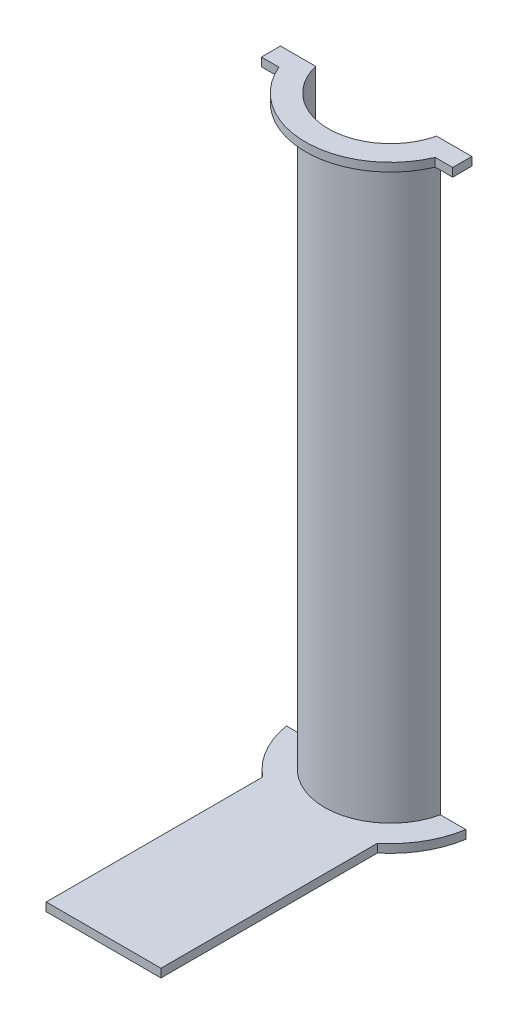
ISO-10303-21;
HEADER;
FILE_DESCRIPTION(('STEP AP214'),'2;1');
FILE_NAME('part.step','',(''),(''),'','','');
FILE_SCHEMA(('AUTOMOTIVE_DESIGN { 1 0 10303 214 1 1 1 1 }'));
ENDSEC;
DATA;
#1=APPLICATION_CONTEXT('core data for automotive mechanical design processes');
#2=APPLICATION_PROTOCOL_DEFINITION('international standard','automotive_design',2000,#1);
#3=PRODUCT_CONTEXT('',#1,'mechanical');
#4=PRODUCT('Part','Part','',(#3));
#5=PRODUCT_RELATED_PRODUCT_CATEGORY('part','',(#4));
#6=PRODUCT_DEFINITION_FORMATION('','',#4);
#7=PRODUCT_DEFINITION_CONTEXT('part definition',#1,'design');
#8=PRODUCT_DEFINITION('design','',#6,#7);
#9=PRODUCT_DEFINITION_SHAPE('','',#8);
#10=(LENGTH_UNIT() NAMED_UNIT(*) SI_UNIT(.MILLI.,.METRE.));
#11=(NAMED_UNIT(*) PLANE_ANGLE_UNIT() SI_UNIT($,.RADIAN.));
#12=(NAMED_UNIT(*) SI_UNIT($,.STERADIAN.) SOLID_ANGLE_UNIT());
#13=UNCERTAINTY_MEASURE_WITH_UNIT(LENGTH_MEASURE(1.E-05),#10,'distance_accuracy_value','');
#14=(GEOMETRIC_REPRESENTATION_CONTEXT(3) GLOBAL_UNCERTAINTY_ASSIGNED_CONTEXT((#13)) GLOBAL_UNIT_ASSIGNED_CONTEXT((#10,
#11,#12)) REPRESENTATION_CONTEXT('',''));
#15=CARTESIAN_POINT('',(0.,0.,0.));
#16=DIRECTION('',(0.,0.,1.));
#17=DIRECTION('',(1.,0.,0.));
#18=AXIS2_PLACEMENT_3D('',#15,#16,#17);
#19=CARTESIAN_POINT('',(4.064,3.711630352635,-5.7911999999999));
#20=DIRECTION('',(0.,-1.,0.));
#21=DIRECTION('',(-1.,0.,0.));
#22=AXIS2_PLACEMENT_3D('',#19,#20,#21);
#23=CYLINDRICAL_SURFACE('',#22,0.350000000000001);
#24=CARTESIAN_POINT('',(4.064,2.9306,-5.7911999999999));
#25=DIRECTION('',(0.,-1.,0.));
#26=DIRECTION('',(1.,0.,0.));
#27=AXIS2_PLACEMENT_3D('',#24,#25,#26);
#28=CIRCLE('',#27,0.350000000000007);
#29=CARTESIAN_POINT('',(4.4056043910725,2.9306,-5.7149999999999));
#30=VERTEX_POINT('',#29);
#31=CARTESIAN_POINT('',(3.7223956089275,2.9306,-5.7149999999999));
#32=VERTEX_POINT('',#31);
#33=EDGE_CURVE('E11',#30,#32,#28,.T.);
#34=ORIENTED_EDGE('',*,*,#33,.T.);
#35=DIRECTION('',(0.,-1.,0.));
#36=VECTOR('',#35,1.);
#37=CARTESIAN_POINT('',(3.7223956089275,3.711630352635,-5.7149999999999));
#38=LINE('',#37,#36);
#39=CARTESIAN_POINT('',(3.7223956089275,-0.1366,-5.7149999999999));
#40=VERTEX_POINT('',#39);
#41=EDGE_CURVE('E24',#32,#40,#38,.T.);
#42=ORIENTED_EDGE('',*,*,#41,.T.);
#43=CARTESIAN_POINT('',(4.064,-0.1366,-5.7911999999999));
#44=DIRECTION('',(0.,-1.,0.));
#45=DIRECTION('',(1.,0.,0.));
#46=AXIS2_PLACEMENT_3D('',#43,#44,#45);
#47=CIRCLE('',#46,0.350000000000001);
#48=CARTESIAN_POINT('',(4.4056043910725,-0.1366,-5.7149999999999));
#49=VERTEX_POINT('',#48);
#50=EDGE_CURVE('E261',#49,#40,#47,.T.);
#51=ORIENTED_EDGE('',*,*,#50,.F.);
#52=DIRECTION('',(0.,-1.,0.));
#53=VECTOR('',#52,1.);
#54=CARTESIAN_POINT('',(4.4056043910725,3.711630352635,-5.7149999999999));
#55=LINE('',#54,#53);
#56=EDGE_CURVE('E258',#30,#49,#55,.T.);
#57=ORIENTED_EDGE('',*,*,#56,.F.);
#58=EDGE_LOOP('',(#34,#42,#51,#57));
#59=FACE_BOUND('',#58,.T.);
#60=ADVANCED_FACE('F17',(#59),#23,.T.);
#61=CARTESIAN_POINT('',(4.5405462411981,-0.1816,-5.7149999999999));
#62=DIRECTION('',(0.,0.,-1.));
#63=DIRECTION('',(0.,1.,0.));
#64=AXIS2_PLACEMENT_3D('',#61,#62,#63);
#65=PLANE('',#64);
#66=DIRECTION('',(-1.,0.,0.));
#67=VECTOR('',#66,1.);
#68=CARTESIAN_POINT('',(4.5405462411981,-0.1366,-5.7149999999999));
#69=LINE('',#68,#67);
#70=CARTESIAN_POINT('',(4.5405462411981,-0.1366,-5.7149999999999));
#71=VERTEX_POINT('',#70);
#72=EDGE_CURVE('E255',#71,#49,#69,.T.);
#73=ORIENTED_EDGE('',*,*,#72,.F.);
#74=DIRECTION('',(0.,1.,0.));
#75=VECTOR('',#74,1.);
#76=CARTESIAN_POINT('',(4.5405462411981,-0.1816,-5.7149999999999));
#77=LINE('',#76,#75);
#78=CARTESIAN_POINT('',(4.5405462411981,-0.1816,-5.7149999999999));
#79=VERTEX_POINT('',#78);
#80=EDGE_CURVE('E252',#79,#71,#77,.T.);
#81=ORIENTED_EDGE('',*,*,#80,.F.);
#82=DIRECTION('',(-1.,0.,0.));
#83=VECTOR('',#82,1.);
#84=CARTESIAN_POINT('',(4.5405462411981,-0.1816,-5.7149999999999));
#85=LINE('',#84,#83);
#86=CARTESIAN_POINT('',(4.3850818587215,-0.1816,-5.7149999999999));
#87=VERTEX_POINT('',#86);
#88=EDGE_CURVE('E250',#79,#87,#85,.T.);
#89=ORIENTED_EDGE('',*,*,#88,.T.);
#90=DIRECTION('',(0.,-1.,0.));
#91=VECTOR('',#90,1.);
#92=CARTESIAN_POINT('',(4.3850818587215,3.711630352635,-5.7149999999999));
#93=LINE('',#92,#91);
#94=CARTESIAN_POINT('',(4.3850818587215,2.9756,-5.7149999999999));
#95=VERTEX_POINT('',#94);
#96=EDGE_CURVE('E247',#95,#87,#93,.T.);
#97=ORIENTED_EDGE('',*,*,#96,.F.);
#98=DIRECTION('',(-1.,0.,0.));
#99=VECTOR('',#98,1.);
#100=CARTESIAN_POINT('',(4.3850818587215,2.9756,-5.7149999999999));
#101=LINE('',#100,#99);
#102=CARTESIAN_POINT('',(4.572,2.9756,-5.7149999999999));
#103=VERTEX_POINT('',#102);
#104=EDGE_CURVE('E244',#103,#95,#101,.T.);
#105=ORIENTED_EDGE('',*,*,#104,.F.);
#106=DIRECTION('',(0.,-1.,0.));
#107=VECTOR('',#106,1.);
#108=CARTESIAN_POINT('',(4.572,2.9756,-5.7149999999999));
#109=LINE('',#108,#107);
#110=CARTESIAN_POINT('',(4.572,2.9306,-5.7149999999999));
#111=VERTEX_POINT('',#110);
#112=EDGE_CURVE('E242',#103,#111,#109,.T.);
#113=ORIENTED_EDGE('',*,*,#112,.T.);
#114=DIRECTION('',(-1.,0.,0.));
#115=VECTOR('',#114,1.);
#116=CARTESIAN_POINT('',(4.4056043910725,2.9306,-5.7149999999999));
#117=LINE('',#116,#115);
#118=EDGE_CURVE('E149',#111,#30,#117,.T.);
#119=ORIENTED_EDGE('',*,*,#118,.T.);
#120=ORIENTED_EDGE('',*,*,#56,.T.);
#121=EDGE_LOOP('',(#73,#81,#89,#97,#105,#113,#119,#120));
#122=FACE_BOUND('',#121,.T.);
#123=ADVANCED_FACE('F289',(#122),#65,.T.);
#124=CARTESIAN_POINT('',(4.064,-0.1816,-5.7911999999999));
#125=DIRECTION('',(0.,1.,0.));
#126=DIRECTION('',(1.,0.,0.));
#127=AXIS2_PLACEMENT_3D('',#124,#125,#126);
#128=CYLINDRICAL_SURFACE('',#127,0.482599999999999);
#129=CARTESIAN_POINT('',(4.064,-0.1366,-5.7911999999999));
#130=DIRECTION('',(0.,1.,0.));
#131=DIRECTION('',(1.,0.,0.));
#132=AXIS2_PLACEMENT_3D('',#129,#130,#131);
#133=CIRCLE('',#132,0.482599999999999);
#134=CARTESIAN_POINT('',(4.3688000000001,-0.1366,-5.4170346354885));
#135=VERTEX_POINT('',#134);
#136=EDGE_CURVE('E238',#135,#71,#133,.T.);
#137=ORIENTED_EDGE('',*,*,#136,.F.);
#138=DIRECTION('',(0.,1.,0.));
#139=VECTOR('',#138,1.);
#140=CARTESIAN_POINT('',(4.3688000000001,-0.1816,-5.4170346354885));
#141=LINE('',#140,#139);
#142=CARTESIAN_POINT('',(4.3688000000001,-0.1816,-5.4170346354885));
#143=VERTEX_POINT('',#142);
#144=EDGE_CURVE('E235',#143,#135,#141,.T.);
#145=ORIENTED_EDGE('',*,*,#144,.F.);
#146=CARTESIAN_POINT('',(4.064,-0.1816,-5.7911999999999));
#147=DIRECTION('',(0.,1.,0.));
#148=DIRECTION('',(1.,0.,0.));
#149=AXIS2_PLACEMENT_3D('',#146,#147,#148);
#150=CIRCLE('',#149,0.482599999999999);
#151=EDGE_CURVE('E232',#143,#79,#150,.T.);
#152=ORIENTED_EDGE('',*,*,#151,.T.);
#153=ORIENTED_EDGE('',*,*,#80,.T.);
#154=EDGE_LOOP('',(#137,#145,#152,#153));
#155=FACE_BOUND('',#154,.T.);
#156=ADVANCED_FACE('F287',(#155),#128,.T.);
#157=CARTESIAN_POINT('',(4.3688000000001,-0.1816,-5.4170346354885));
#158=DIRECTION('',(1.,0.,0.));
#159=DIRECTION('',(0.,0.,-1.));
#160=AXIS2_PLACEMENT_3D('',#157,#158,#159);
#161=PLANE('',#160);
#162=DIRECTION('',(0.,0.,-1.));
#163=VECTOR('',#162,1.);
#164=CARTESIAN_POINT('',(4.3688000000001,-0.1366,-5.4170346354885));
#165=LINE('',#164,#163);
#166=CARTESIAN_POINT('',(4.3688000000001,-0.1366,-4.2671999999999));
#167=VERTEX_POINT('',#166);
#168=EDGE_CURVE('E229',#167,#135,#165,.T.);
#169=ORIENTED_EDGE('',*,*,#168,.F.);
#170=DIRECTION('',(0.,1.,0.));
#171=VECTOR('',#170,1.);
#172=CARTESIAN_POINT('',(4.3688000000001,-0.1816,-4.2671999999999));
#173=LINE('',#172,#171);
#174=CARTESIAN_POINT('',(4.3688000000001,-0.1816,-4.2671999999999));
#175=VERTEX_POINT('',#174);
#176=EDGE_CURVE('E226',#175,#167,#173,.T.);
#177=ORIENTED_EDGE('',*,*,#176,.F.);
#178=DIRECTION('',(0.,0.,-1.));
#179=VECTOR('',#178,1.);
#180=CARTESIAN_POINT('',(4.3688000000001,-0.1816,-5.4170346354885));
#181=LINE('',#180,#179);
#182=EDGE_CURVE('E223',#175,#143,#181,.T.);
#183=ORIENTED_EDGE('',*,*,#182,.T.);
#184=ORIENTED_EDGE('',*,*,#144,.T.);
#185=EDGE_LOOP('',(#169,#177,#183,#184));
#186=FACE_BOUND('',#185,.T.);
#187=ADVANCED_FACE('F283',(#186),#161,.T.);
#188=CARTESIAN_POINT('',(4.3688000000001,-0.1816,-4.2671999999999));
#189=DIRECTION('',(0.,0.,1.));
#190=DIRECTION('',(1.,0.,0.));
#191=AXIS2_PLACEMENT_3D('',#188,#189,#190);
#192=PLANE('',#191);
#193=DIRECTION('',(1.,0.,0.));
#194=VECTOR('',#193,1.);
#195=CARTESIAN_POINT('',(4.3688000000001,-0.1366,-4.2671999999999));
#196=LINE('',#195,#194);
#197=CARTESIAN_POINT('',(3.7592,-0.1366,-4.2671999999999));
#198=VERTEX_POINT('',#197);
#199=EDGE_CURVE('E220',#198,#167,#196,.T.);
#200=ORIENTED_EDGE('',*,*,#199,.F.);
#201=DIRECTION('',(0.,1.,0.));
#202=VECTOR('',#201,1.);
#203=CARTESIAN_POINT('',(3.7592,-0.1816,-4.2671999999999));
#204=LINE('',#203,#202);
#205=CARTESIAN_POINT('',(3.7592,-0.1816,-4.2671999999999));
#206=VERTEX_POINT('',#205);
#207=EDGE_CURVE('E217',#206,#198,#204,.T.);
#208=ORIENTED_EDGE('',*,*,#207,.F.);
#209=DIRECTION('',(1.,0.,0.));
#210=VECTOR('',#209,1.);
#211=CARTESIAN_POINT('',(4.3688000000001,-0.1816,-4.2671999999999));
#212=LINE('',#211,#210);
#213=EDGE_CURVE('E214',#206,#175,#212,.T.);
#214=ORIENTED_EDGE('',*,*,#213,.T.);
#215=ORIENTED_EDGE('',*,*,#176,.T.);
#216=EDGE_LOOP('',(#200,#208,#214,#215));
#217=FACE_BOUND('',#216,.T.);
#218=ADVANCED_FACE('F281',(#217),#192,.T.);
#219=CARTESIAN_POINT('',(3.7592,-0.1816,-4.2671999999999));
#220=DIRECTION('',(-1.,0.,0.));
#221=DIRECTION('',(0.,0.,1.));
#222=AXIS2_PLACEMENT_3D('',#219,#220,#221);
#223=PLANE('',#222);
#224=DIRECTION('',(0.,0.,1.));
#225=VECTOR('',#224,1.);
#226=CARTESIAN_POINT('',(3.7592,-0.1366,-4.2671999999999));
#227=LINE('',#226,#225);
#228=CARTESIAN_POINT('',(3.7592,-0.1366,-5.4170346354885));
#229=VERTEX_POINT('',#228);
#230=EDGE_CURVE('E211',#229,#198,#227,.T.);
#231=ORIENTED_EDGE('',*,*,#230,.F.);
#232=DIRECTION('',(0.,1.,0.));
#233=VECTOR('',#232,1.);
#234=CARTESIAN_POINT('',(3.7592,-0.1816,-5.4170346354885));
#235=LINE('',#234,#233);
#236=CARTESIAN_POINT('',(3.7592,-0.1816,-5.4170346354885));
#237=VERTEX_POINT('',#236);
#238=EDGE_CURVE('E208',#237,#229,#235,.T.);
#239=ORIENTED_EDGE('',*,*,#238,.F.);
#240=DIRECTION('',(0.,0.,1.));
#241=VECTOR('',#240,1.);
#242=CARTESIAN_POINT('',(3.7592,-0.1816,-4.2671999999999));
#243=LINE('',#242,#241);
#244=EDGE_CURVE('E205',#237,#206,#243,.T.);
#245=ORIENTED_EDGE('',*,*,#244,.T.);
#246=ORIENTED_EDGE('',*,*,#207,.T.);
#247=EDGE_LOOP('',(#231,#239,#245,#246));
#248=FACE_BOUND('',#247,.T.);
#249=ADVANCED_FACE('F279',(#248),#223,.T.);
#250=CARTESIAN_POINT('',(4.064,-0.1816,-5.7911999999999));
#251=DIRECTION('',(0.,1.,0.));
#252=DIRECTION('',(1.,0.,0.));
#253=AXIS2_PLACEMENT_3D('',#250,#251,#252);
#254=CYLINDRICAL_SURFACE('',#253,0.482600000000001);
#255=CARTESIAN_POINT('',(4.064,-0.1366,-5.7911999999999));
#256=DIRECTION('',(0.,1.,0.));
#257=DIRECTION('',(1.,0.,0.));
#258=AXIS2_PLACEMENT_3D('',#255,#256,#257);
#259=CIRCLE('',#258,0.482600000000001);
#260=CARTESIAN_POINT('',(3.587453758802,-0.1366,-5.7149999999999));
#261=VERTEX_POINT('',#260);
#262=EDGE_CURVE('E202',#261,#229,#259,.T.);
#263=ORIENTED_EDGE('',*,*,#262,.F.);
#264=DIRECTION('',(0.,1.,0.));
#265=VECTOR('',#264,1.);
#266=CARTESIAN_POINT('',(3.587453758802,-0.1816,-5.7149999999999));
#267=LINE('',#266,#265);
#268=CARTESIAN_POINT('',(3.587453758802,-0.1816,-5.7149999999999));
#269=VERTEX_POINT('',#268);
#270=EDGE_CURVE('E199',#269,#261,#267,.T.);
#271=ORIENTED_EDGE('',*,*,#270,.F.);
#272=CARTESIAN_POINT('',(4.064,-0.1816,-5.7911999999999));
#273=DIRECTION('',(0.,1.,0.));
#274=DIRECTION('',(1.,0.,0.));
#275=AXIS2_PLACEMENT_3D('',#272,#273,#274);
#276=CIRCLE('',#275,0.482600000000001);
#277=EDGE_CURVE('E196',#269,#237,#276,.T.);
#278=ORIENTED_EDGE('',*,*,#277,.T.);
#279=ORIENTED_EDGE('',*,*,#238,.T.);
#280=EDGE_LOOP('',(#263,#271,#278,#279));
#281=FACE_BOUND('',#280,.T.);
#282=ADVANCED_FACE('F271',(#281),#254,.T.);
#283=CARTESIAN_POINT('',(3.7223956089275,-0.1816,-5.7149999999999));
#284=DIRECTION('',(0.,0.,-1.));
#285=DIRECTION('',(0.,1.,0.));
#286=AXIS2_PLACEMENT_3D('',#283,#284,#285);
#287=PLANE('',#286);
#288=DIRECTION('',(-1.,0.,0.));
#289=VECTOR('',#288,1.);
#290=CARTESIAN_POINT('',(3.7223956089275,-0.1366,-5.7149999999999));
#291=LINE('',#290,#289);
#292=EDGE_CURVE('E193',#40,#261,#291,.T.);
#293=ORIENTED_EDGE('',*,*,#292,.F.);
#294=ORIENTED_EDGE('',*,*,#41,.F.);
#295=DIRECTION('',(-1.,0.,0.));
#296=VECTOR('',#295,1.);
#297=CARTESIAN_POINT('',(3.556,2.9306,-5.7149999999999));
#298=LINE('',#297,#296);
#299=CARTESIAN_POINT('',(3.556,2.9306,-5.7149999999999));
#300=VERTEX_POINT('',#299);
#301=EDGE_CURVE('E191',#32,#300,#298,.T.);
#302=ORIENTED_EDGE('',*,*,#301,.T.);
#303=DIRECTION('',(0.,-1.,0.));
#304=VECTOR('',#303,1.);
#305=CARTESIAN_POINT('',(3.556,2.9756,-5.7149999999999));
#306=LINE('',#305,#304);
#307=CARTESIAN_POINT('',(3.556,2.9756,-5.7149999999999));
#308=VERTEX_POINT('',#307);
#309=EDGE_CURVE('E188',#308,#300,#306,.T.);
#310=ORIENTED_EDGE('',*,*,#309,.F.);
#311=DIRECTION('',(-1.,0.,0.));
#312=VECTOR('',#311,1.);
#313=CARTESIAN_POINT('',(3.7223956089275,2.9756,-5.7149999999999));
#314=LINE('',#313,#312);
#315=CARTESIAN_POINT('',(3.7429181412786,2.9756,-5.7149999999999));
#316=VERTEX_POINT('',#315);
#317=EDGE_CURVE('E185',#316,#308,#314,.T.);
#318=ORIENTED_EDGE('',*,*,#317,.F.);
#319=DIRECTION('',(0.,-1.,0.));
#320=VECTOR('',#319,1.);
#321=CARTESIAN_POINT('',(3.7429181412786,3.711630352635,-5.7149999999999));
#322=LINE('',#321,#320);
#323=CARTESIAN_POINT('',(3.7429181412786,-0.1816,-5.7149999999999));
#324=VERTEX_POINT('',#323);
#325=EDGE_CURVE('E183',#316,#324,#322,.T.);
#326=ORIENTED_EDGE('',*,*,#325,.T.);
#327=DIRECTION('',(-1.,0.,0.));
#328=VECTOR('',#327,1.);
#329=CARTESIAN_POINT('',(3.7223956089275,-0.1816,-5.7149999999999));
#330=LINE('',#329,#328);
#331=EDGE_CURVE('E180',#324,#269,#330,.T.);
#332=ORIENTED_EDGE('',*,*,#331,.T.);
#333=ORIENTED_EDGE('',*,*,#270,.T.);
#334=EDGE_LOOP('',(#293,#294,#302,#310,#318,#326,#332,#333));
#335=FACE_BOUND('',#334,.T.);
#336=ADVANCED_FACE('F267',(#335),#287,.T.);
#337=CARTESIAN_POINT('',(4.064,-0.1816,-5.7911999999999));
#338=DIRECTION('',(0.,1.,0.));
#339=DIRECTION('',(1.,0.,0.));
#340=AXIS2_PLACEMENT_3D('',#337,#338,#339);
#341=PLANE('',#340);
#342=ORIENTED_EDGE('',*,*,#331,.F.);
#343=CARTESIAN_POINT('',(4.064,-0.1816,-5.7911999999999));
#344=DIRECTION('',(0.,-1.,0.));
#345=DIRECTION('',(1.,0.,0.));
#346=AXIS2_PLACEMENT_3D('',#343,#344,#345);
#347=CIRCLE('',#346,0.330000000000001);
#348=EDGE_CURVE('E177',#87,#324,#347,.T.);
#349=ORIENTED_EDGE('',*,*,#348,.F.);
#350=ORIENTED_EDGE('',*,*,#88,.F.);
#351=ORIENTED_EDGE('',*,*,#151,.F.);
#352=ORIENTED_EDGE('',*,*,#182,.F.);
#353=ORIENTED_EDGE('',*,*,#213,.F.);
#354=ORIENTED_EDGE('',*,*,#244,.F.);
#355=ORIENTED_EDGE('',*,*,#277,.F.);
#356=EDGE_LOOP('',(#342,#349,#350,#351,#352,#353,#354,#355));
#357=FACE_BOUND('',#356,.T.);
#358=ADVANCED_FACE('F274',(#357),#341,.F.);
#359=CARTESIAN_POINT('',(4.064,-0.1366,-5.7911999999999));
#360=DIRECTION('',(0.,1.,0.));
#361=DIRECTION('',(1.,0.,0.));
#362=AXIS2_PLACEMENT_3D('',#359,#360,#361);
#363=PLANE('',#362);
#364=ORIENTED_EDGE('',*,*,#50,.T.);
#365=ORIENTED_EDGE('',*,*,#292,.T.);
#366=ORIENTED_EDGE('',*,*,#262,.T.);
#367=ORIENTED_EDGE('',*,*,#230,.T.);
#368=ORIENTED_EDGE('',*,*,#199,.T.);
#369=ORIENTED_EDGE('',*,*,#168,.T.);
#370=ORIENTED_EDGE('',*,*,#136,.T.);
#371=ORIENTED_EDGE('',*,*,#72,.T.);
#372=EDGE_LOOP('',(#364,#365,#366,#367,#368,#369,#370,#371));
#373=FACE_BOUND('',#372,.T.);
#374=ADVANCED_FACE('F266',(#373),#363,.T.);
#375=CARTESIAN_POINT('',(4.064,3.711630352635,-5.7911999999999));
#376=DIRECTION('',(0.,-1.,0.));
#377=DIRECTION('',(-1.,0.,0.));
#378=AXIS2_PLACEMENT_3D('',#375,#376,#377);
#379=CYLINDRICAL_SURFACE('',#378,0.330000000000001);
#380=CARTESIAN_POINT('',(4.064,2.9756,-5.7911999999999));
#381=DIRECTION('',(0.,-1.,0.));
#382=DIRECTION('',(1.,0.,0.));
#383=AXIS2_PLACEMENT_3D('',#380,#381,#382);
#384=CIRCLE('',#383,0.330000000000001);
#385=EDGE_CURVE('E174',#95,#316,#384,.T.);
#386=ORIENTED_EDGE('',*,*,#385,.F.);
#387=ORIENTED_EDGE('',*,*,#96,.T.);
#388=ORIENTED_EDGE('',*,*,#348,.T.);
#389=ORIENTED_EDGE('',*,*,#325,.F.);
#390=EDGE_LOOP('',(#386,#387,#388,#389));
#391=FACE_BOUND('',#390,.T.);
#392=ADVANCED_FACE('F307',(#391),#379,.F.);
#393=CARTESIAN_POINT('',(4.064,2.9756,-5.7911999999999));
#394=DIRECTION('',(0.,1.,0.));
#395=DIRECTION('',(1.,0.,0.));
#396=AXIS2_PLACEMENT_3D('',#393,#394,#395);
#397=PLANE('',#396);
#398=ORIENTED_EDGE('',*,*,#104,.T.);
#399=ORIENTED_EDGE('',*,*,#385,.T.);
#400=ORIENTED_EDGE('',*,*,#317,.T.);
#401=DIRECTION('',(0.,0.,1.));
#402=VECTOR('',#401,1.);
#403=CARTESIAN_POINT('',(3.556,2.9756,-5.6133999999999));
#404=LINE('',#403,#402);
#405=CARTESIAN_POINT('',(3.556,2.9756,-5.6133999999999));
#406=VERTEX_POINT('',#405);
#407=EDGE_CURVE('E172',#308,#406,#404,.T.);
#408=ORIENTED_EDGE('',*,*,#407,.T.);
#409=DIRECTION('',(1.,0.,0.));
#410=VECTOR('',#409,1.);
#411=CARTESIAN_POINT('',(3.556,2.9756,-5.6133999999999));
#412=LINE('',#411,#410);
#413=CARTESIAN_POINT('',(3.6488607961852,2.9756,-5.6133999999999));
#414=VERTEX_POINT('',#413);
#415=EDGE_CURVE('E170',#406,#414,#412,.T.);
#416=ORIENTED_EDGE('',*,*,#415,.T.);
#417=CARTESIAN_POINT('',(4.064,2.9756,-5.7911999999999));
#418=DIRECTION('',(0.,1.,0.));
#419=DIRECTION('',(1.,0.,0.));
#420=AXIS2_PLACEMENT_3D('',#417,#418,#419);
#421=CIRCLE('',#420,0.451612);
#422=CARTESIAN_POINT('',(4.4791392038148,2.9756,-5.6133999999999));
#423=VERTEX_POINT('',#422);
#424=EDGE_CURVE('E168',#414,#423,#421,.T.);
#425=ORIENTED_EDGE('',*,*,#424,.T.);
#426=DIRECTION('',(1.,0.,0.));
#427=VECTOR('',#426,1.);
#428=CARTESIAN_POINT('',(4.4791392038148,2.9756,-5.6133999999999));
#429=LINE('',#428,#427);
#430=CARTESIAN_POINT('',(4.572,2.9756,-5.6133999999999));
#431=VERTEX_POINT('',#430);
#432=EDGE_CURVE('E166',#423,#431,#429,.T.);
#433=ORIENTED_EDGE('',*,*,#432,.T.);
#434=DIRECTION('',(0.,0.,-1.));
#435=VECTOR('',#434,1.);
#436=CARTESIAN_POINT('',(4.572,2.9756,-5.6133999999999));
#437=LINE('',#436,#435);
#438=EDGE_CURVE('E144',#431,#103,#437,.T.);
#439=ORIENTED_EDGE('',*,*,#438,.T.);
#440=EDGE_LOOP('',(#398,#399,#400,#408,#416,#425,#433,#439));
#441=FACE_BOUND('',#440,.T.);
#442=ADVANCED_FACE('F291',(#441),#397,.T.);
#443=CARTESIAN_POINT('',(3.556,2.9756,-5.6133999999999));
#444=DIRECTION('',(1.,0.,0.));
#445=DIRECTION('',(0.,-1.,0.));
#446=AXIS2_PLACEMENT_3D('',#443,#444,#445);
#447=PLANE('',#446);
#448=DIRECTION('',(0.,0.,1.));
#449=VECTOR('',#448,1.);
#450=CARTESIAN_POINT('',(3.556,2.9306,-5.6133999999999));
#451=LINE('',#450,#449);
#452=CARTESIAN_POINT('',(3.556,2.9306,-5.6133999999999));
#453=VERTEX_POINT('',#452);
#454=EDGE_CURVE('E163',#300,#453,#451,.T.);
#455=ORIENTED_EDGE('',*,*,#454,.T.);
#456=DIRECTION('',(0.,-1.,0.));
#457=VECTOR('',#456,1.);
#458=CARTESIAN_POINT('',(3.556,2.9756,-5.6133999999999));
#459=LINE('',#458,#457);
#460=EDGE_CURVE('E160',#406,#453,#459,.T.);
#461=ORIENTED_EDGE('',*,*,#460,.F.);
#462=ORIENTED_EDGE('',*,*,#407,.F.);
#463=ORIENTED_EDGE('',*,*,#309,.T.);
#464=EDGE_LOOP('',(#455,#461,#462,#463));
#465=FACE_BOUND('',#464,.T.);
#466=ADVANCED_FACE('F304',(#465),#447,.F.);
#467=CARTESIAN_POINT('',(3.556,2.9756,-5.6133999999999));
#468=DIRECTION('',(0.,0.,-1.));
#469=DIRECTION('',(0.,1.,0.));
#470=AXIS2_PLACEMENT_3D('',#467,#468,#469);
#471=PLANE('',#470);
#472=DIRECTION('',(1.,0.,0.));
#473=VECTOR('',#472,1.);
#474=CARTESIAN_POINT('',(3.556,2.9306,-5.6133999999999));
#475=LINE('',#474,#473);
#476=CARTESIAN_POINT('',(3.6488607961852,2.9306,-5.6133999999999));
#477=VERTEX_POINT('',#476);
#478=EDGE_CURVE('E158',#453,#477,#475,.T.);
#479=ORIENTED_EDGE('',*,*,#478,.T.);
#480=DIRECTION('',(0.,-1.,0.));
#481=VECTOR('',#480,1.);
#482=CARTESIAN_POINT('',(3.6488607961852,2.9756,-5.6133999999999));
#483=LINE('',#482,#481);
#484=EDGE_CURVE('E155',#414,#477,#483,.T.);
#485=ORIENTED_EDGE('',*,*,#484,.F.);
#486=ORIENTED_EDGE('',*,*,#415,.F.);
#487=ORIENTED_EDGE('',*,*,#460,.T.);
#488=EDGE_LOOP('',(#479,#485,#486,#487));
#489=FACE_BOUND('',#488,.T.);
#490=ADVANCED_FACE('F299',(#489),#471,.F.);
#491=CARTESIAN_POINT('',(4.064,2.9756,-5.7911999999999));
#492=DIRECTION('',(0.,-1.,0.));
#493=DIRECTION('',(-1.,0.,0.));
#494=AXIS2_PLACEMENT_3D('',#491,#492,#493);
#495=CYLINDRICAL_SURFACE('',#494,0.451612);
#496=CARTESIAN_POINT('',(4.064,2.9306,-5.7911999999999));
#497=DIRECTION('',(0.,1.,0.));
#498=DIRECTION('',(1.,0.,0.));
#499=AXIS2_PLACEMENT_3D('',#496,#497,#498);
#500=CIRCLE('',#499,0.451612);
#501=CARTESIAN_POINT('',(4.4791392038148,2.9306,-5.6133999999999));
#502=VERTEX_POINT('',#501);
#503=EDGE_CURVE('E153',#477,#502,#500,.T.);
#504=ORIENTED_EDGE('',*,*,#503,.T.);
#505=DIRECTION('',(0.,-1.,0.));
#506=VECTOR('',#505,1.);
#507=CARTESIAN_POINT('',(4.4791392038148,2.9756,-5.6133999999999));
#508=LINE('',#507,#506);
#509=EDGE_CURVE('E133',#423,#502,#508,.T.);
#510=ORIENTED_EDGE('',*,*,#509,.F.);
#511=ORIENTED_EDGE('',*,*,#424,.F.);
#512=ORIENTED_EDGE('',*,*,#484,.T.);
#513=EDGE_LOOP('',(#504,#510,#511,#512));
#514=FACE_BOUND('',#513,.T.);
#515=ADVANCED_FACE('F295',(#514),#495,.T.);
#516=CARTESIAN_POINT('',(4.4791392038148,2.9756,-5.6133999999999));
#517=DIRECTION('',(0.,0.,-1.));
#518=DIRECTION('',(0.,1.,0.));
#519=AXIS2_PLACEMENT_3D('',#516,#517,#518);
#520=PLANE('',#519);
#521=DIRECTION('',(1.,0.,0.));
#522=VECTOR('',#521,1.);
#523=CARTESIAN_POINT('',(4.4791392038148,2.9306,-5.6133999999999));
#524=LINE('',#523,#522);
#525=CARTESIAN_POINT('',(4.572,2.9306,-5.6133999999999));
#526=VERTEX_POINT('',#525);
#527=EDGE_CURVE('E127',#502,#526,#524,.T.);
#528=ORIENTED_EDGE('',*,*,#527,.T.);
#529=DIRECTION('',(0.,-1.,0.));
#530=VECTOR('',#529,1.);
#531=CARTESIAN_POINT('',(4.572,2.9756,-5.6133999999999));
#532=LINE('',#531,#530);
#533=EDGE_CURVE('E131',#431,#526,#532,.T.);
#534=ORIENTED_EDGE('',*,*,#533,.F.);
#535=ORIENTED_EDGE('',*,*,#432,.F.);
#536=ORIENTED_EDGE('',*,*,#509,.T.);
#537=EDGE_LOOP('',(#528,#534,#535,#536));
#538=FACE_BOUND('',#537,.T.);
#539=ADVANCED_FACE('F129',(#538),#520,.F.);
#540=CARTESIAN_POINT('',(4.572,2.9756,-5.6133999999999));
#541=DIRECTION('',(-1.,0.,0.));
#542=DIRECTION('',(0.,1.,0.));
#543=AXIS2_PLACEMENT_3D('',#540,#541,#542);
#544=PLANE('',#543);
#545=DIRECTION('',(0.,0.,-1.));
#546=VECTOR('',#545,1.);
#547=CARTESIAN_POINT('',(4.572,2.9306,-5.6133999999999));
#548=LINE('',#547,#546);
#549=EDGE_CURVE('E142',#526,#111,#548,.T.);
#550=ORIENTED_EDGE('',*,*,#549,.T.);
#551=ORIENTED_EDGE('',*,*,#112,.F.);
#552=ORIENTED_EDGE('',*,*,#438,.F.);
#553=ORIENTED_EDGE('',*,*,#533,.T.);
#554=EDGE_LOOP('',(#550,#551,#552,#553));
#555=FACE_BOUND('',#554,.T.);
#556=ADVANCED_FACE('F140',(#555),#544,.F.);
#557=CARTESIAN_POINT('',(4.064,2.9306,-5.7911999999999));
#558=DIRECTION('',(0.,1.,0.));
#559=DIRECTION('',(1.,0.,0.));
#560=AXIS2_PLACEMENT_3D('',#557,#558,#559);
#561=PLANE('',#560);
#562=ORIENTED_EDGE('',*,*,#454,.F.);
#563=ORIENTED_EDGE('',*,*,#301,.F.);
#564=ORIENTED_EDGE('',*,*,#33,.F.);
#565=ORIENTED_EDGE('',*,*,#118,.F.);
#566=ORIENTED_EDGE('',*,*,#549,.F.);
#567=ORIENTED_EDGE('',*,*,#527,.F.);
#568=ORIENTED_EDGE('',*,*,#503,.F.);
#569=ORIENTED_EDGE('',*,*,#478,.F.);
#570=EDGE_LOOP('',(#562,#563,#564,#565,#566,#567,#568,#569));
#571=FACE_BOUND('',#570,.T.);
#572=ADVANCED_FACE('F147',(#571),#561,.F.);
#573=CLOSED_SHELL('',(#60,#123,#156,#187,#218,#249,#282,#336,#358,#374,#392,#442,#466,#490,#515,
#539,#556,#572));
#574=MANIFOLD_SOLID_BREP('B1',#573);
#575=ADVANCED_BREP_SHAPE_REPRESENTATION('',(#18,#574),#14);
#576=SHAPE_DEFINITION_REPRESENTATION(#9,#575);
ENDSEC;
END-ISO-10303-21;
